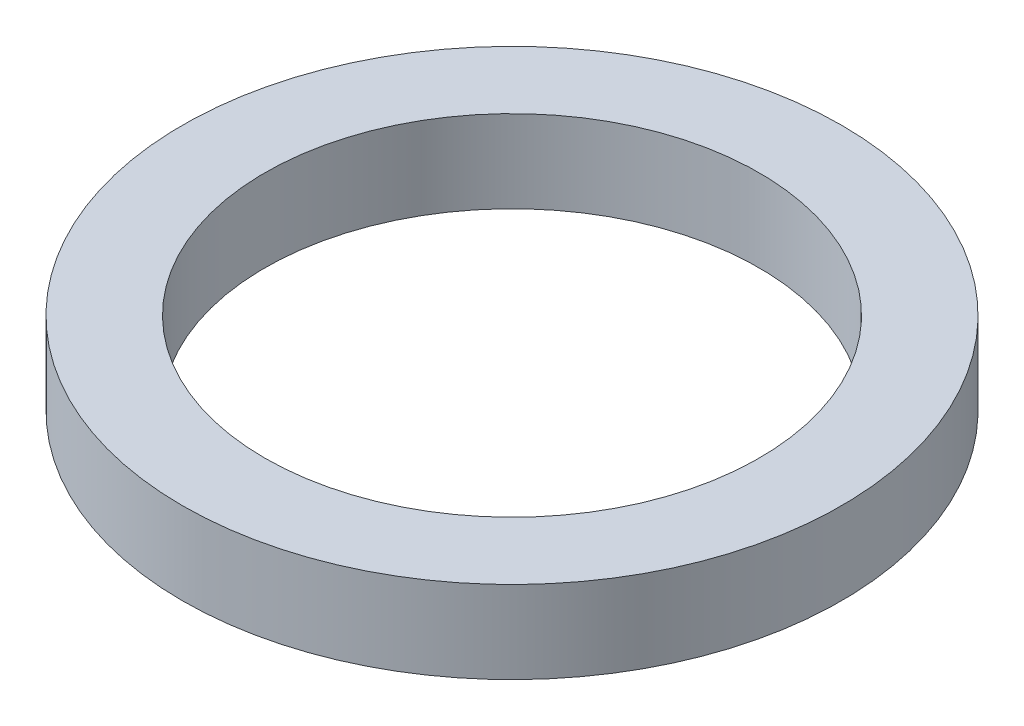
ISO-10303-21;
HEADER;
FILE_DESCRIPTION(('STEP AP214'),'2;1');
FILE_NAME('part.step','',(''),(''),'','','');
FILE_SCHEMA(('AUTOMOTIVE_DESIGN { 1 0 10303 214 1 1 1 1 }'));
ENDSEC;
DATA;
#1=APPLICATION_CONTEXT('core data for automotive mechanical design processes');
#2=APPLICATION_PROTOCOL_DEFINITION('international standard','automotive_design',2000,#1);
#3=PRODUCT_CONTEXT('',#1,'mechanical');
#4=PRODUCT('Part','Part','',(#3));
#5=PRODUCT_RELATED_PRODUCT_CATEGORY('part','',(#4));
#6=PRODUCT_DEFINITION_FORMATION('','',#4);
#7=PRODUCT_DEFINITION_CONTEXT('part definition',#1,'design');
#8=PRODUCT_DEFINITION('design','',#6,#7);
#9=PRODUCT_DEFINITION_SHAPE('','',#8);
#10=(LENGTH_UNIT() NAMED_UNIT(*) SI_UNIT(.MILLI.,.METRE.));
#11=(NAMED_UNIT(*) PLANE_ANGLE_UNIT() SI_UNIT($,.RADIAN.));
#12=(NAMED_UNIT(*) SI_UNIT($,.STERADIAN.) SOLID_ANGLE_UNIT());
#13=UNCERTAINTY_MEASURE_WITH_UNIT(LENGTH_MEASURE(1.E-05),#10,'distance_accuracy_value','');
#14=(GEOMETRIC_REPRESENTATION_CONTEXT(3) GLOBAL_UNCERTAINTY_ASSIGNED_CONTEXT((#13)) GLOBAL_UNIT_ASSIGNED_CONTEXT((#10,
#11,#12)) REPRESENTATION_CONTEXT('',''));
#15=CARTESIAN_POINT('',(0.,0.,0.));
#16=DIRECTION('',(0.,0.,1.));
#17=DIRECTION('',(1.,0.,0.));
#18=AXIS2_PLACEMENT_3D('',#15,#16,#17);
#19=CARTESIAN_POINT('',(0.,4.,0.));
#20=DIRECTION('',(0.,1.,0.));
#21=DIRECTION('',(0.,0.,1.));
#22=AXIS2_PLACEMENT_3D('',#19,#20,#21);
#23=PLANE('',#22);
#24=CARTESIAN_POINT('',(0.,4.,0.));
#25=DIRECTION('',(0.,1.,0.));
#26=DIRECTION('',(0.,0.,1.));
#27=AXIS2_PLACEMENT_3D('',#24,#25,#26);
#28=CIRCLE('',#27,16.);
#29=CARTESIAN_POINT('',(0.,4.,16.));
#30=VERTEX_POINT('',#29);
#31=EDGE_CURVE('E10',#30,#30,#28,.T.);
#32=ORIENTED_EDGE('',*,*,#31,.T.);
#33=EDGE_LOOP('',(#32));
#34=FACE_BOUND('',#33,.T.);
#35=CARTESIAN_POINT('',(0.,4.,0.));
#36=DIRECTION('',(0.,1.,0.));
#37=DIRECTION('',(0.,0.,1.));
#38=AXIS2_PLACEMENT_3D('',#35,#36,#37);
#39=CIRCLE('',#38,12.);
#40=CARTESIAN_POINT('',(0.,4.,12.));
#41=VERTEX_POINT('',#40);
#42=EDGE_CURVE('E42',#41,#41,#39,.T.);
#43=ORIENTED_EDGE('',*,*,#42,.F.);
#44=EDGE_LOOP('',(#43));
#45=FACE_BOUND('',#44,.T.);
#46=ADVANCED_FACE('F31',(#34,#45),#23,.T.);
#47=CARTESIAN_POINT('',(0.,0.,0.));
#48=DIRECTION('',(0.,1.,0.));
#49=DIRECTION('',(0.,0.,1.));
#50=AXIS2_PLACEMENT_3D('',#47,#48,#49);
#51=PLANE('',#50);
#52=CARTESIAN_POINT('',(0.,0.,0.));
#53=DIRECTION('',(0.,1.,0.));
#54=DIRECTION('',(0.,0.,1.));
#55=AXIS2_PLACEMENT_3D('',#52,#53,#54);
#56=CIRCLE('',#55,16.);
#57=CARTESIAN_POINT('',(0.,0.,16.));
#58=VERTEX_POINT('',#57);
#59=EDGE_CURVE('E35',#58,#58,#56,.T.);
#60=ORIENTED_EDGE('',*,*,#59,.F.);
#61=EDGE_LOOP('',(#60));
#62=FACE_BOUND('',#61,.T.);
#63=CARTESIAN_POINT('',(0.,0.,0.));
#64=DIRECTION('',(0.,1.,0.));
#65=DIRECTION('',(0.,0.,1.));
#66=AXIS2_PLACEMENT_3D('',#63,#64,#65);
#67=CIRCLE('',#66,12.);
#68=CARTESIAN_POINT('',(0.,0.,12.));
#69=VERTEX_POINT('',#68);
#70=EDGE_CURVE('E44',#69,#69,#67,.T.);
#71=ORIENTED_EDGE('',*,*,#70,.T.);
#72=EDGE_LOOP('',(#71));
#73=FACE_BOUND('',#72,.T.);
#74=ADVANCED_FACE('F54',(#62,#73),#51,.F.);
#75=CARTESIAN_POINT('',(0.,4.,0.));
#76=DIRECTION('',(0.,-1.,0.));
#77=DIRECTION('',(0.,0.,-1.));
#78=AXIS2_PLACEMENT_3D('',#75,#76,#77);
#79=CYLINDRICAL_SURFACE('',#78,16.);
#80=ORIENTED_EDGE('',*,*,#31,.F.);
#81=EDGE_LOOP('',(#80));
#82=FACE_BOUND('',#81,.T.);
#83=ORIENTED_EDGE('',*,*,#59,.T.);
#84=EDGE_LOOP('',(#83));
#85=FACE_BOUND('',#84,.T.);
#86=ADVANCED_FACE('F33',(#82,#85),#79,.T.);
#87=CARTESIAN_POINT('',(0.,4.,0.));
#88=DIRECTION('',(0.,-1.,0.));
#89=DIRECTION('',(0.,0.,-1.));
#90=AXIS2_PLACEMENT_3D('',#87,#88,#89);
#91=CYLINDRICAL_SURFACE('',#90,12.);
#92=ORIENTED_EDGE('',*,*,#42,.T.);
#93=EDGE_LOOP('',(#92));
#94=FACE_BOUND('',#93,.T.);
#95=ORIENTED_EDGE('',*,*,#70,.F.);
#96=EDGE_LOOP('',(#95));
#97=FACE_BOUND('',#96,.T.);
#98=ADVANCED_FACE('F50',(#94,#97),#91,.F.);
#99=CLOSED_SHELL('',(#46,#74,#86,#98));
#100=MANIFOLD_SOLID_BREP('B2',#99);
#101=ADVANCED_BREP_SHAPE_REPRESENTATION('',(#18,#100),#14);
#102=SHAPE_DEFINITION_REPRESENTATION(#9,#101);
ENDSEC;
END-ISO-10303-21;
